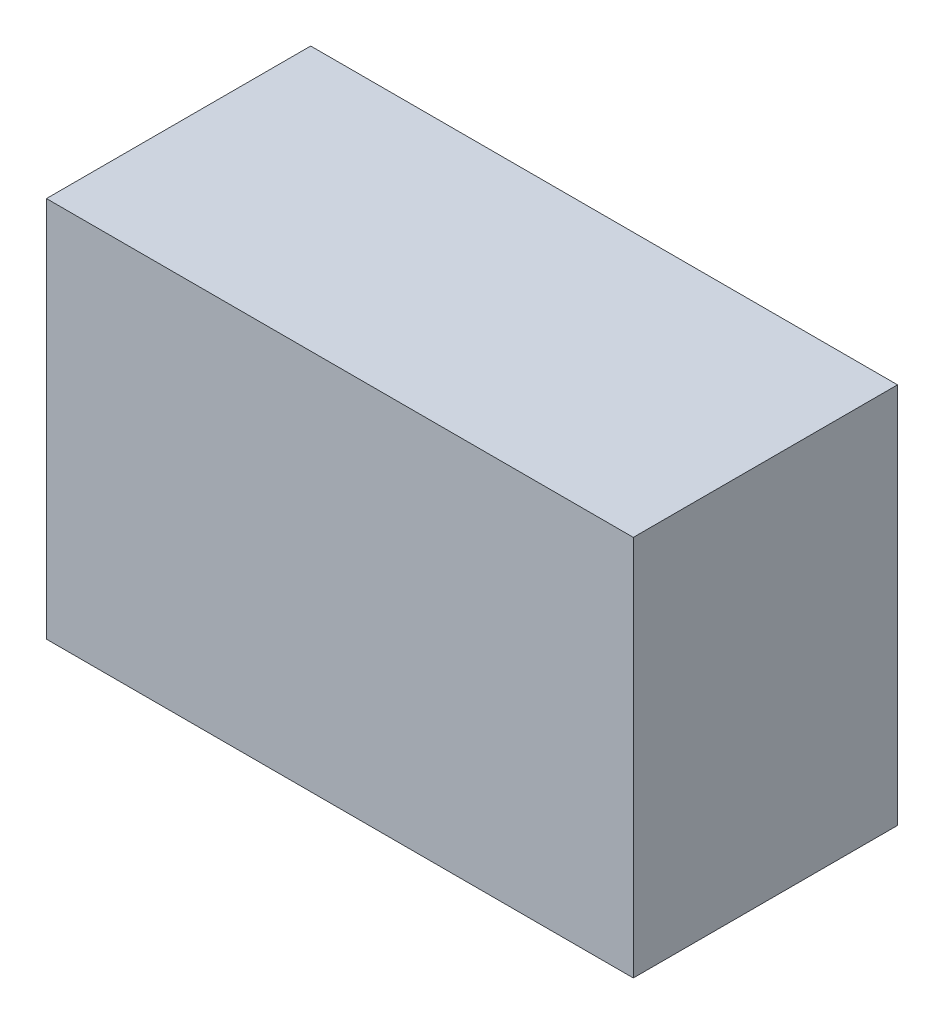
ISO-10303-21;
HEADER;
FILE_DESCRIPTION(('STEP AP214'),'2;1');
FILE_NAME('part.step','',(''),(''),'','','');
FILE_SCHEMA(('AUTOMOTIVE_DESIGN { 1 0 10303 214 1 1 1 1 }'));
ENDSEC;
DATA;
#1=APPLICATION_CONTEXT('core data for automotive mechanical design processes');
#2=APPLICATION_PROTOCOL_DEFINITION('international standard','automotive_design',2000,#1);
#3=PRODUCT_CONTEXT('',#1,'mechanical');
#4=PRODUCT('Part','Part','',(#3));
#5=PRODUCT_RELATED_PRODUCT_CATEGORY('part','',(#4));
#6=PRODUCT_DEFINITION_FORMATION('','',#4);
#7=PRODUCT_DEFINITION_CONTEXT('part definition',#1,'design');
#8=PRODUCT_DEFINITION('design','',#6,#7);
#9=PRODUCT_DEFINITION_SHAPE('','',#8);
#10=(LENGTH_UNIT() NAMED_UNIT(*) SI_UNIT(.MILLI.,.METRE.));
#11=(NAMED_UNIT(*) PLANE_ANGLE_UNIT() SI_UNIT($,.RADIAN.));
#12=(NAMED_UNIT(*) SI_UNIT($,.STERADIAN.) SOLID_ANGLE_UNIT());
#13=UNCERTAINTY_MEASURE_WITH_UNIT(LENGTH_MEASURE(1.E-05),#10,'distance_accuracy_value','');
#14=(GEOMETRIC_REPRESENTATION_CONTEXT(3) GLOBAL_UNCERTAINTY_ASSIGNED_CONTEXT((#13)) GLOBAL_UNIT_ASSIGNED_CONTEXT((#10,
#11,#12)) REPRESENTATION_CONTEXT('',''));
#15=CARTESIAN_POINT('',(0.,0.,0.));
#16=DIRECTION('',(0.,0.,1.));
#17=DIRECTION('',(1.,0.,0.));
#18=AXIS2_PLACEMENT_3D('',#15,#16,#17);
#19=CARTESIAN_POINT('',(5.07499874,3.30000102,4.57000102));
#20=DIRECTION('',(0.,0.,-1.));
#21=DIRECTION('',(0.,-1.,0.));
#22=AXIS2_PLACEMENT_3D('',#19,#20,#21);
#23=PLANE('',#22);
#24=DIRECTION('',(-1.,0.,0.));
#25=VECTOR('',#24,1.);
#26=CARTESIAN_POINT('',(5.07499874,3.30000102,4.57000102));
#27=LINE('',#26,#25);
#28=CARTESIAN_POINT('',(5.07499874,3.30000102,4.57000102));
#29=VERTEX_POINT('',#28);
#30=CARTESIAN_POINT('',(-5.07499874,3.30000102,4.57000102));
#31=VERTEX_POINT('',#30);
#32=EDGE_CURVE('E90',#29,#31,#27,.T.);
#33=ORIENTED_EDGE('',*,*,#32,.T.);
#34=DIRECTION('',(0.,-1.,0.));
#35=VECTOR('',#34,1.);
#36=CARTESIAN_POINT('',(-5.07499874,3.30000102,4.57000102));
#37=LINE('',#36,#35);
#38=CARTESIAN_POINT('',(-5.07499874,-3.30000102,4.57000102));
#39=VERTEX_POINT('',#38);
#40=EDGE_CURVE('E64',#31,#39,#37,.T.);
#41=ORIENTED_EDGE('',*,*,#40,.T.);
#42=DIRECTION('',(1.,0.,0.));
#43=VECTOR('',#42,1.);
#44=CARTESIAN_POINT('',(-5.07499874,-3.30000102,4.57000102));
#45=LINE('',#44,#43);
#46=CARTESIAN_POINT('',(5.07499874,-3.30000102,4.57000102));
#47=VERTEX_POINT('',#46);
#48=EDGE_CURVE('E83',#39,#47,#45,.T.);
#49=ORIENTED_EDGE('',*,*,#48,.T.);
#50=DIRECTION('',(0.,1.,0.));
#51=VECTOR('',#50,1.);
#52=CARTESIAN_POINT('',(5.07499874,-3.30000102,4.57000102));
#53=LINE('',#52,#51);
#54=EDGE_CURVE('E11',#47,#29,#53,.T.);
#55=ORIENTED_EDGE('',*,*,#54,.T.);
#56=EDGE_LOOP('',(#33,#41,#49,#55));
#57=FACE_BOUND('',#56,.T.);
#58=ADVANCED_FACE('F16',(#57),#23,.F.);
#59=CARTESIAN_POINT('',(5.07499874,3.30000102,0.));
#60=DIRECTION('',(0.,0.,-1.));
#61=DIRECTION('',(0.,-1.,0.));
#62=AXIS2_PLACEMENT_3D('',#59,#60,#61);
#63=PLANE('',#62);
#64=DIRECTION('',(0.,1.,0.));
#65=VECTOR('',#64,1.);
#66=CARTESIAN_POINT('',(5.07499874,-3.30000102,0.));
#67=LINE('',#66,#65);
#68=CARTESIAN_POINT('',(5.07499874,-3.30000102,0.));
#69=VERTEX_POINT('',#68);
#70=CARTESIAN_POINT('',(5.07499874,3.30000102,0.));
#71=VERTEX_POINT('',#70);
#72=EDGE_CURVE('E26',#69,#71,#67,.T.);
#73=ORIENTED_EDGE('',*,*,#72,.F.);
#74=DIRECTION('',(1.,0.,0.));
#75=VECTOR('',#74,1.);
#76=CARTESIAN_POINT('',(-5.07499874,-3.30000102,0.));
#77=LINE('',#76,#75);
#78=CARTESIAN_POINT('',(-5.07499874,-3.30000102,0.));
#79=VERTEX_POINT('',#78);
#80=EDGE_CURVE('E104',#79,#69,#77,.T.);
#81=ORIENTED_EDGE('',*,*,#80,.F.);
#82=DIRECTION('',(0.,-1.,0.));
#83=VECTOR('',#82,1.);
#84=CARTESIAN_POINT('',(-5.07499874,3.30000102,0.));
#85=LINE('',#84,#83);
#86=CARTESIAN_POINT('',(-5.07499874,3.30000102,0.));
#87=VERTEX_POINT('',#86);
#88=EDGE_CURVE('E72',#87,#79,#85,.T.);
#89=ORIENTED_EDGE('',*,*,#88,.F.);
#90=DIRECTION('',(-1.,0.,0.));
#91=VECTOR('',#90,1.);
#92=CARTESIAN_POINT('',(5.07499874,3.30000102,0.));
#93=LINE('',#92,#91);
#94=EDGE_CURVE('E89',#71,#87,#93,.T.);
#95=ORIENTED_EDGE('',*,*,#94,.F.);
#96=EDGE_LOOP('',(#73,#81,#89,#95));
#97=FACE_BOUND('',#96,.T.);
#98=ADVANCED_FACE('F18',(#97),#63,.T.);
#99=CARTESIAN_POINT('',(5.07499874,-3.30000102,0.));
#100=DIRECTION('',(-1.,0.,0.));
#101=DIRECTION('',(0.,0.,1.));
#102=AXIS2_PLACEMENT_3D('',#99,#100,#101);
#103=PLANE('',#102);
#104=ORIENTED_EDGE('',*,*,#72,.T.);
#105=DIRECTION('',(0.,0.,1.));
#106=VECTOR('',#105,1.);
#107=CARTESIAN_POINT('',(5.07499874,3.30000102,0.));
#108=LINE('',#107,#106);
#109=EDGE_CURVE('E77',#71,#29,#108,.T.);
#110=ORIENTED_EDGE('',*,*,#109,.T.);
#111=ORIENTED_EDGE('',*,*,#54,.F.);
#112=DIRECTION('',(0.,0.,1.));
#113=VECTOR('',#112,1.);
#114=CARTESIAN_POINT('',(5.07499874,-3.30000102,0.));
#115=LINE('',#114,#113);
#116=EDGE_CURVE('E80',#69,#47,#115,.T.);
#117=ORIENTED_EDGE('',*,*,#116,.F.);
#118=EDGE_LOOP('',(#104,#110,#111,#117));
#119=FACE_BOUND('',#118,.T.);
#120=ADVANCED_FACE('F76',(#119),#103,.F.);
#121=CARTESIAN_POINT('',(-5.07499874,-3.30000102,0.));
#122=DIRECTION('',(0.,1.,0.));
#123=DIRECTION('',(1.,0.,0.));
#124=AXIS2_PLACEMENT_3D('',#121,#122,#123);
#125=PLANE('',#124);
#126=ORIENTED_EDGE('',*,*,#80,.T.);
#127=ORIENTED_EDGE('',*,*,#116,.T.);
#128=ORIENTED_EDGE('',*,*,#48,.F.);
#129=DIRECTION('',(0.,0.,1.));
#130=VECTOR('',#129,1.);
#131=CARTESIAN_POINT('',(-5.07499874,-3.30000102,0.));
#132=LINE('',#131,#130);
#133=EDGE_CURVE('E103',#79,#39,#132,.T.);
#134=ORIENTED_EDGE('',*,*,#133,.F.);
#135=EDGE_LOOP('',(#126,#127,#128,#134));
#136=FACE_BOUND('',#135,.T.);
#137=ADVANCED_FACE('F157',(#136),#125,.F.);
#138=CARTESIAN_POINT('',(-5.07499874,3.30000102,0.));
#139=DIRECTION('',(1.,0.,0.));
#140=DIRECTION('',(0.,1.,0.));
#141=AXIS2_PLACEMENT_3D('',#138,#139,#140);
#142=PLANE('',#141);
#143=ORIENTED_EDGE('',*,*,#88,.T.);
#144=ORIENTED_EDGE('',*,*,#133,.T.);
#145=ORIENTED_EDGE('',*,*,#40,.F.);
#146=DIRECTION('',(0.,0.,1.));
#147=VECTOR('',#146,1.);
#148=CARTESIAN_POINT('',(-5.07499874,3.30000102,0.));
#149=LINE('',#148,#147);
#150=EDGE_CURVE('E94',#87,#31,#149,.T.);
#151=ORIENTED_EDGE('',*,*,#150,.F.);
#152=EDGE_LOOP('',(#143,#144,#145,#151));
#153=FACE_BOUND('',#152,.T.);
#154=ADVANCED_FACE('F122',(#153),#142,.F.);
#155=CARTESIAN_POINT('',(5.07499874,3.30000102,0.));
#156=DIRECTION('',(0.,-1.,0.));
#157=DIRECTION('',(0.,0.,-1.));
#158=AXIS2_PLACEMENT_3D('',#155,#156,#157);
#159=PLANE('',#158);
#160=ORIENTED_EDGE('',*,*,#94,.T.);
#161=ORIENTED_EDGE('',*,*,#150,.T.);
#162=ORIENTED_EDGE('',*,*,#32,.F.);
#163=ORIENTED_EDGE('',*,*,#109,.F.);
#164=EDGE_LOOP('',(#160,#161,#162,#163));
#165=FACE_BOUND('',#164,.T.);
#166=ADVANCED_FACE('F87',(#165),#159,.F.);
#167=CLOSED_SHELL('',(#58,#98,#120,#137,#154,#166));
#168=MANIFOLD_SOLID_BREP('B1',#167);
#169=ADVANCED_BREP_SHAPE_REPRESENTATION('',(#18,#168),#14);
#170=SHAPE_DEFINITION_REPRESENTATION(#9,#169);
ENDSEC;
END-ISO-10303-21;
